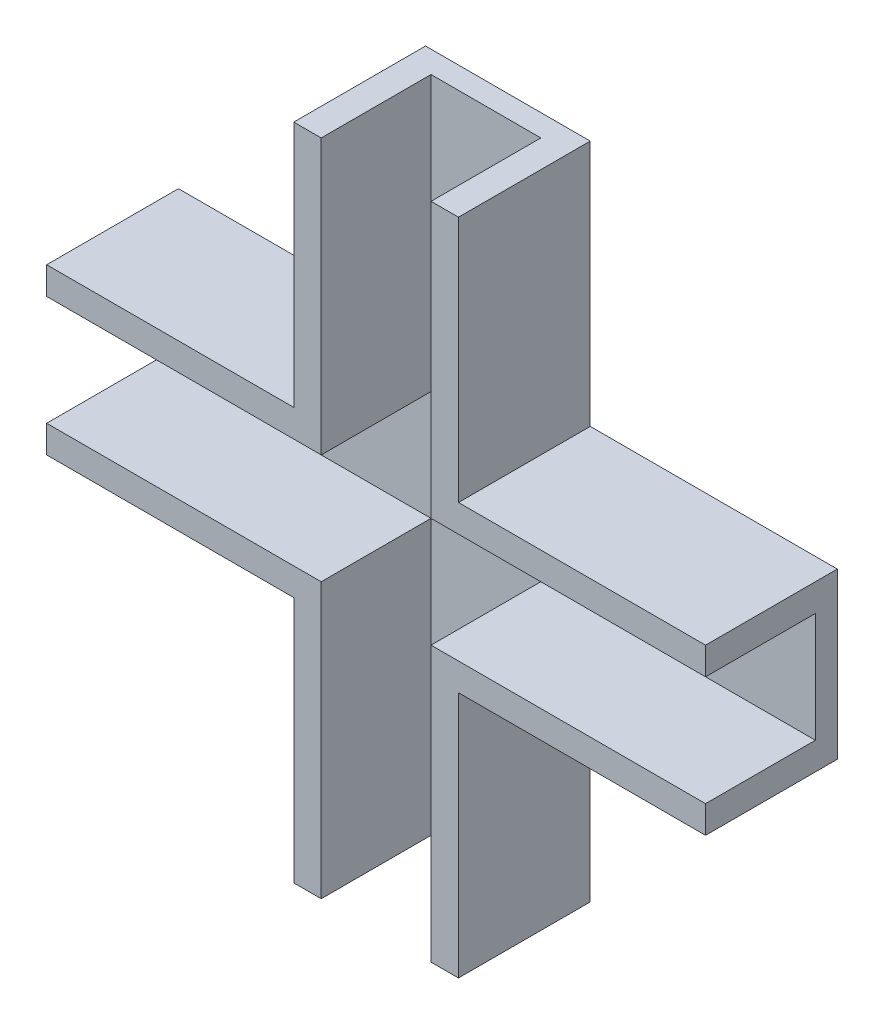
ISO-10303-21;
HEADER;
FILE_DESCRIPTION(('STEP AP214'),'2;1');
FILE_NAME('part.step','',(''),(''),'','','');
FILE_SCHEMA(('AUTOMOTIVE_DESIGN { 1 0 10303 214 1 1 1 1 }'));
ENDSEC;
DATA;
#1=APPLICATION_CONTEXT('core data for automotive mechanical design processes');
#2=APPLICATION_PROTOCOL_DEFINITION('international standard','automotive_design',2000,#1);
#3=PRODUCT_CONTEXT('',#1,'mechanical');
#4=PRODUCT('Part','Part','',(#3));
#5=PRODUCT_RELATED_PRODUCT_CATEGORY('part','',(#4));
#6=PRODUCT_DEFINITION_FORMATION('','',#4);
#7=PRODUCT_DEFINITION_CONTEXT('part definition',#1,'design');
#8=PRODUCT_DEFINITION('design','',#6,#7);
#9=PRODUCT_DEFINITION_SHAPE('','',#8);
#10=(LENGTH_UNIT() NAMED_UNIT(*) SI_UNIT(.MILLI.,.METRE.));
#11=(NAMED_UNIT(*) PLANE_ANGLE_UNIT() SI_UNIT($,.RADIAN.));
#12=(NAMED_UNIT(*) SI_UNIT($,.STERADIAN.) SOLID_ANGLE_UNIT());
#13=UNCERTAINTY_MEASURE_WITH_UNIT(LENGTH_MEASURE(1.E-05),#10,'distance_accuracy_value','');
#14=(GEOMETRIC_REPRESENTATION_CONTEXT(3) GLOBAL_UNCERTAINTY_ASSIGNED_CONTEXT((#13)) GLOBAL_UNIT_ASSIGNED_CONTEXT((#10,
#11,#12)) REPRESENTATION_CONTEXT('',''));
#15=CARTESIAN_POINT('',(0.,0.,0.));
#16=DIRECTION('',(0.,0.,1.));
#17=DIRECTION('',(1.,0.,0.));
#18=AXIS2_PLACEMENT_3D('',#15,#16,#17);
#19=CARTESIAN_POINT('',(0.,0.,6.));
#20=DIRECTION('',(0.,0.,1.));
#21=DIRECTION('',(1.,0.,0.));
#22=AXIS2_PLACEMENT_3D('',#19,#20,#21);
#23=PLANE('',#22);
#24=DIRECTION('',(0.,-1.,0.));
#25=VECTOR('',#24,1.);
#26=CARTESIAN_POINT('',(2.5,0.,6.));
#27=LINE('',#26,#25);
#28=CARTESIAN_POINT('',(2.5,15.,6.));
#29=VERTEX_POINT('',#28);
#30=CARTESIAN_POINT('',(2.5,2.5,6.));
#31=VERTEX_POINT('',#30);
#32=EDGE_CURVE('E370',#29,#31,#27,.T.);
#33=ORIENTED_EDGE('',*,*,#32,.T.);
#34=DIRECTION('',(1.,0.,0.));
#35=VECTOR('',#34,1.);
#36=CARTESIAN_POINT('',(0.,2.5,6.));
#37=LINE('',#36,#35);
#38=CARTESIAN_POINT('',(15.,2.50000000000001,6.));
#39=VERTEX_POINT('',#38);
#40=EDGE_CURVE('E367',#31,#39,#37,.T.);
#41=ORIENTED_EDGE('',*,*,#40,.T.);
#42=DIRECTION('',(0.,1.,0.));
#43=VECTOR('',#42,1.);
#44=CARTESIAN_POINT('',(15.,3.75,6.));
#45=LINE('',#44,#43);
#46=CARTESIAN_POINT('',(15.,3.75,6.));
#47=VERTEX_POINT('',#46);
#48=EDGE_CURVE('E120',#39,#47,#45,.T.);
#49=ORIENTED_EDGE('',*,*,#48,.T.);
#50=DIRECTION('',(-1.,0.,0.));
#51=VECTOR('',#50,1.);
#52=CARTESIAN_POINT('',(3.75,3.75,6.));
#53=LINE('',#52,#51);
#54=CARTESIAN_POINT('',(3.75,3.75,6.));
#55=VERTEX_POINT('',#54);
#56=EDGE_CURVE('E325',#47,#55,#53,.T.);
#57=ORIENTED_EDGE('',*,*,#56,.T.);
#58=DIRECTION('',(0.,1.,0.));
#59=VECTOR('',#58,1.);
#60=CARTESIAN_POINT('',(3.75,15.,6.));
#61=LINE('',#60,#59);
#62=CARTESIAN_POINT('',(3.75,15.,6.));
#63=VERTEX_POINT('',#62);
#64=EDGE_CURVE('E231',#55,#63,#61,.T.);
#65=ORIENTED_EDGE('',*,*,#64,.T.);
#66=DIRECTION('',(-1.,0.,0.));
#67=VECTOR('',#66,1.);
#68=CARTESIAN_POINT('',(-3.75,15.,6.));
#69=LINE('',#68,#67);
#70=EDGE_CURVE('E251',#63,#29,#69,.T.);
#71=ORIENTED_EDGE('',*,*,#70,.T.);
#72=EDGE_LOOP('',(#33,#41,#49,#57,#65,#71));
#73=FACE_BOUND('',#72,.T.);
#74=ADVANCED_FACE('F39',(#73),#23,.T.);
#75=DIRECTION('',(0.,1.,0.));
#76=VECTOR('',#75,1.);
#77=CARTESIAN_POINT('',(2.5,0.,6.));
#78=LINE('',#77,#76);
#79=CARTESIAN_POINT('',(2.5,-15.,6.));
#80=VERTEX_POINT('',#79);
#81=CARTESIAN_POINT('',(2.5,-2.5,6.));
#82=VERTEX_POINT('',#81);
#83=EDGE_CURVE('E154',#80,#82,#78,.T.);
#84=ORIENTED_EDGE('',*,*,#83,.F.);
#85=DIRECTION('',(1.,0.,0.));
#86=VECTOR('',#85,1.);
#87=CARTESIAN_POINT('',(-3.75,-15.,6.));
#88=LINE('',#87,#86);
#89=CARTESIAN_POINT('',(3.75,-15.,6.));
#90=VERTEX_POINT('',#89);
#91=EDGE_CURVE('E150',#80,#90,#88,.T.);
#92=ORIENTED_EDGE('',*,*,#91,.T.);
#93=DIRECTION('',(0.,1.,0.));
#94=VECTOR('',#93,1.);
#95=CARTESIAN_POINT('',(3.75,-15.,6.));
#96=LINE('',#95,#94);
#97=CARTESIAN_POINT('',(3.75,-3.75,6.));
#98=VERTEX_POINT('',#97);
#99=EDGE_CURVE('E151',#90,#98,#96,.T.);
#100=ORIENTED_EDGE('',*,*,#99,.T.);
#101=DIRECTION('',(1.,0.,0.));
#102=VECTOR('',#101,1.);
#103=CARTESIAN_POINT('',(3.75,-3.75,6.));
#104=LINE('',#103,#102);
#105=CARTESIAN_POINT('',(15.,-3.75,6.));
#106=VERTEX_POINT('',#105);
#107=EDGE_CURVE('E61',#98,#106,#104,.T.);
#108=ORIENTED_EDGE('',*,*,#107,.T.);
#109=CARTESIAN_POINT('',(15.,-2.5,6.));
#110=VERTEX_POINT('',#109);
#111=EDGE_CURVE('E319',#106,#110,#45,.T.);
#112=ORIENTED_EDGE('',*,*,#111,.T.);
#113=DIRECTION('',(1.,0.,0.));
#114=VECTOR('',#113,1.);
#115=CARTESIAN_POINT('',(0.,-2.5,6.));
#116=LINE('',#115,#114);
#117=EDGE_CURVE('E375',#82,#110,#116,.T.);
#118=ORIENTED_EDGE('',*,*,#117,.F.);
#119=EDGE_LOOP('',(#84,#92,#100,#108,#112,#118));
#120=FACE_BOUND('',#119,.T.);
#121=ADVANCED_FACE('F149',(#120),#23,.T.);
#122=DIRECTION('',(0.,-1.,0.));
#123=VECTOR('',#122,1.);
#124=CARTESIAN_POINT('',(-2.5,0.,6.));
#125=LINE('',#124,#123);
#126=CARTESIAN_POINT('',(-2.5,15.,6.));
#127=VERTEX_POINT('',#126);
#128=CARTESIAN_POINT('',(-2.5,2.5,6.));
#129=VERTEX_POINT('',#128);
#130=EDGE_CURVE('E327',#127,#129,#125,.T.);
#131=ORIENTED_EDGE('',*,*,#130,.F.);
#132=CARTESIAN_POINT('',(-3.75,15.,6.));
#133=VERTEX_POINT('',#132);
#134=EDGE_CURVE('E256',#127,#133,#69,.T.);
#135=ORIENTED_EDGE('',*,*,#134,.T.);
#136=DIRECTION('',(0.,-1.,0.));
#137=VECTOR('',#136,1.);
#138=CARTESIAN_POINT('',(-3.75,3.75,6.));
#139=LINE('',#138,#137);
#140=CARTESIAN_POINT('',(-3.75,3.75,6.));
#141=VERTEX_POINT('',#140);
#142=EDGE_CURVE('E247',#133,#141,#139,.T.);
#143=ORIENTED_EDGE('',*,*,#142,.T.);
#144=DIRECTION('',(-1.,0.,0.));
#145=VECTOR('',#144,1.);
#146=CARTESIAN_POINT('',(-15.,3.75,6.));
#147=LINE('',#146,#145);
#148=CARTESIAN_POINT('',(-15.,3.75,6.));
#149=VERTEX_POINT('',#148);
#150=EDGE_CURVE('E252',#141,#149,#147,.T.);
#151=ORIENTED_EDGE('',*,*,#150,.T.);
#152=DIRECTION('',(0.,-1.,0.));
#153=VECTOR('',#152,1.);
#154=CARTESIAN_POINT('',(-15.,3.75,6.));
#155=LINE('',#154,#153);
#156=CARTESIAN_POINT('',(-15.,2.5,6.));
#157=VERTEX_POINT('',#156);
#158=EDGE_CURVE('E265',#149,#157,#155,.T.);
#159=ORIENTED_EDGE('',*,*,#158,.T.);
#160=DIRECTION('',(1.,0.,0.));
#161=VECTOR('',#160,1.);
#162=CARTESIAN_POINT('',(0.,2.5,6.));
#163=LINE('',#162,#161);
#164=EDGE_CURVE('E358',#157,#129,#163,.T.);
#165=ORIENTED_EDGE('',*,*,#164,.T.);
#166=EDGE_LOOP('',(#131,#135,#143,#151,#159,#165));
#167=FACE_BOUND('',#166,.T.);
#168=ADVANCED_FACE('F322',(#167),#23,.T.);
#169=CARTESIAN_POINT('',(15.,3.75,6.));
#170=DIRECTION('',(-1.,0.,0.));
#171=DIRECTION('',(0.,0.,1.));
#172=AXIS2_PLACEMENT_3D('',#169,#170,#171);
#173=PLANE('',#172);
#174=DIRECTION('',(0.,1.,0.));
#175=VECTOR('',#174,1.);
#176=CARTESIAN_POINT('',(15.,0.,1.));
#177=LINE('',#176,#175);
#178=CARTESIAN_POINT('',(15.,-2.5,1.));
#179=VERTEX_POINT('',#178);
#180=CARTESIAN_POINT('',(15.,2.50000000000001,1.));
#181=VERTEX_POINT('',#180);
#182=EDGE_CURVE('E398',#179,#181,#177,.T.);
#183=ORIENTED_EDGE('',*,*,#182,.F.);
#184=DIRECTION('',(0.,0.,1.));
#185=VECTOR('',#184,1.);
#186=CARTESIAN_POINT('',(15.,-2.5,1.));
#187=LINE('',#186,#185);
#188=EDGE_CURVE('E314',#179,#110,#187,.T.);
#189=ORIENTED_EDGE('',*,*,#188,.T.);
#190=ORIENTED_EDGE('',*,*,#111,.F.);
#191=DIRECTION('',(0.,0.,-1.));
#192=VECTOR('',#191,1.);
#193=CARTESIAN_POINT('',(15.,-3.75,6.));
#194=LINE('',#193,#192);
#195=CARTESIAN_POINT('',(15.,-3.75,0.));
#196=VERTEX_POINT('',#195);
#197=EDGE_CURVE('E174',#106,#196,#194,.T.);
#198=ORIENTED_EDGE('',*,*,#197,.T.);
#199=DIRECTION('',(0.,1.,0.));
#200=VECTOR('',#199,1.);
#201=CARTESIAN_POINT('',(15.,3.75,0.));
#202=LINE('',#201,#200);
#203=CARTESIAN_POINT('',(15.,3.75,0.));
#204=VERTEX_POINT('',#203);
#205=EDGE_CURVE('E179',#196,#204,#202,.T.);
#206=ORIENTED_EDGE('',*,*,#205,.T.);
#207=DIRECTION('',(0.,0.,-1.));
#208=VECTOR('',#207,1.);
#209=CARTESIAN_POINT('',(15.,3.75,6.));
#210=LINE('',#209,#208);
#211=EDGE_CURVE('E11',#47,#204,#210,.T.);
#212=ORIENTED_EDGE('',*,*,#211,.F.);
#213=ORIENTED_EDGE('',*,*,#48,.F.);
#214=DIRECTION('',(0.,0.,1.));
#215=VECTOR('',#214,1.);
#216=CARTESIAN_POINT('',(15.,2.50000000000001,1.));
#217=LINE('',#216,#215);
#218=EDGE_CURVE('E313',#181,#39,#217,.T.);
#219=ORIENTED_EDGE('',*,*,#218,.F.);
#220=EDGE_LOOP('',(#183,#189,#190,#198,#206,#212,#213,#219));
#221=FACE_BOUND('',#220,.T.);
#222=ADVANCED_FACE('F41',(#221),#173,.F.);
#223=CARTESIAN_POINT('',(3.75,3.75,6.));
#224=DIRECTION('',(0.,-1.,0.));
#225=DIRECTION('',(0.,0.,-1.));
#226=AXIS2_PLACEMENT_3D('',#223,#224,#225);
#227=PLANE('',#226);
#228=DIRECTION('',(-1.,0.,0.));
#229=VECTOR('',#228,1.);
#230=CARTESIAN_POINT('',(3.75,3.75,0.));
#231=LINE('',#230,#229);
#232=CARTESIAN_POINT('',(3.75,3.75,0.));
#233=VERTEX_POINT('',#232);
#234=EDGE_CURVE('E181',#204,#233,#231,.T.);
#235=ORIENTED_EDGE('',*,*,#234,.T.);
#236=DIRECTION('',(0.,0.,-1.));
#237=VECTOR('',#236,1.);
#238=CARTESIAN_POINT('',(3.75,3.75,6.));
#239=LINE('',#238,#237);
#240=EDGE_CURVE('E50',#55,#233,#239,.T.);
#241=ORIENTED_EDGE('',*,*,#240,.F.);
#242=ORIENTED_EDGE('',*,*,#56,.F.);
#243=ORIENTED_EDGE('',*,*,#211,.T.);
#244=EDGE_LOOP('',(#235,#241,#242,#243));
#245=FACE_BOUND('',#244,.T.);
#246=ADVANCED_FACE('F649',(#245),#227,.F.);
#247=CARTESIAN_POINT('',(3.75,15.,6.));
#248=DIRECTION('',(-1.,0.,0.));
#249=DIRECTION('',(0.,0.,1.));
#250=AXIS2_PLACEMENT_3D('',#247,#248,#249);
#251=PLANE('',#250);
#252=DIRECTION('',(0.,1.,0.));
#253=VECTOR('',#252,1.);
#254=CARTESIAN_POINT('',(3.75,15.,0.));
#255=LINE('',#254,#253);
#256=CARTESIAN_POINT('',(3.75,15.,0.));
#257=VERTEX_POINT('',#256);
#258=EDGE_CURVE('E188',#233,#257,#255,.T.);
#259=ORIENTED_EDGE('',*,*,#258,.T.);
#260=DIRECTION('',(0.,0.,-1.));
#261=VECTOR('',#260,1.);
#262=CARTESIAN_POINT('',(3.75,15.,6.));
#263=LINE('',#262,#261);
#264=EDGE_CURVE('E225',#63,#257,#263,.T.);
#265=ORIENTED_EDGE('',*,*,#264,.F.);
#266=ORIENTED_EDGE('',*,*,#64,.F.);
#267=ORIENTED_EDGE('',*,*,#240,.T.);
#268=EDGE_LOOP('',(#259,#265,#266,#267));
#269=FACE_BOUND('',#268,.T.);
#270=ADVANCED_FACE('F227',(#269),#251,.F.);
#271=CARTESIAN_POINT('',(-3.75,15.,6.));
#272=DIRECTION('',(0.,-1.,0.));
#273=DIRECTION('',(0.,0.,-1.));
#274=AXIS2_PLACEMENT_3D('',#271,#272,#273);
#275=PLANE('',#274);
#276=DIRECTION('',(-1.,0.,0.));
#277=VECTOR('',#276,1.);
#278=CARTESIAN_POINT('',(0.,15.,1.));
#279=LINE('',#278,#277);
#280=CARTESIAN_POINT('',(2.5,15.,1.));
#281=VERTEX_POINT('',#280);
#282=CARTESIAN_POINT('',(-2.5,15.,1.));
#283=VERTEX_POINT('',#282);
#284=EDGE_CURVE('E386',#281,#283,#279,.T.);
#285=ORIENTED_EDGE('',*,*,#284,.F.);
#286=DIRECTION('',(0.,0.,1.));
#287=VECTOR('',#286,1.);
#288=CARTESIAN_POINT('',(2.5,15.,1.));
#289=LINE('',#288,#287);
#290=EDGE_CURVE('E304',#281,#29,#289,.T.);
#291=ORIENTED_EDGE('',*,*,#290,.T.);
#292=ORIENTED_EDGE('',*,*,#70,.F.);
#293=ORIENTED_EDGE('',*,*,#264,.T.);
#294=DIRECTION('',(-1.,0.,0.));
#295=VECTOR('',#294,1.);
#296=CARTESIAN_POINT('',(-3.75,15.,0.));
#297=LINE('',#296,#295);
#298=CARTESIAN_POINT('',(-3.75,15.,0.));
#299=VERTEX_POINT('',#298);
#300=EDGE_CURVE('E186',#257,#299,#297,.T.);
#301=ORIENTED_EDGE('',*,*,#300,.T.);
#302=DIRECTION('',(0.,0.,-1.));
#303=VECTOR('',#302,1.);
#304=CARTESIAN_POINT('',(-3.75,15.,6.));
#305=LINE('',#304,#303);
#306=EDGE_CURVE('E218',#133,#299,#305,.T.);
#307=ORIENTED_EDGE('',*,*,#306,.F.);
#308=ORIENTED_EDGE('',*,*,#134,.F.);
#309=DIRECTION('',(0.,0.,1.));
#310=VECTOR('',#309,1.);
#311=CARTESIAN_POINT('',(-2.5,15.,1.));
#312=LINE('',#311,#310);
#313=EDGE_CURVE('E305',#283,#127,#312,.T.);
#314=ORIENTED_EDGE('',*,*,#313,.F.);
#315=EDGE_LOOP('',(#285,#291,#292,#293,#301,#307,#308,#314));
#316=FACE_BOUND('',#315,.T.);
#317=ADVANCED_FACE('F245',(#316),#275,.F.);
#318=CARTESIAN_POINT('',(-3.75,3.75,6.));
#319=DIRECTION('',(1.,0.,0.));
#320=DIRECTION('',(0.,0.,-1.));
#321=AXIS2_PLACEMENT_3D('',#318,#319,#320);
#322=PLANE('',#321);
#323=DIRECTION('',(0.,-1.,0.));
#324=VECTOR('',#323,1.);
#325=CARTESIAN_POINT('',(-3.75,3.75,0.));
#326=LINE('',#325,#324);
#327=CARTESIAN_POINT('',(-3.75,3.75,0.));
#328=VERTEX_POINT('',#327);
#329=EDGE_CURVE('E189',#299,#328,#326,.T.);
#330=ORIENTED_EDGE('',*,*,#329,.T.);
#331=DIRECTION('',(0.,0.,-1.));
#332=VECTOR('',#331,1.);
#333=CARTESIAN_POINT('',(-3.75,3.75,6.));
#334=LINE('',#333,#332);
#335=EDGE_CURVE('E216',#141,#328,#334,.T.);
#336=ORIENTED_EDGE('',*,*,#335,.F.);
#337=ORIENTED_EDGE('',*,*,#142,.F.);
#338=ORIENTED_EDGE('',*,*,#306,.T.);
#339=EDGE_LOOP('',(#330,#336,#337,#338));
#340=FACE_BOUND('',#339,.T.);
#341=ADVANCED_FACE('F250',(#340),#322,.F.);
#342=CARTESIAN_POINT('',(-15.,3.75,6.));
#343=DIRECTION('',(0.,-1.,0.));
#344=DIRECTION('',(0.,0.,-1.));
#345=AXIS2_PLACEMENT_3D('',#342,#343,#344);
#346=PLANE('',#345);
#347=DIRECTION('',(-1.,0.,0.));
#348=VECTOR('',#347,1.);
#349=CARTESIAN_POINT('',(-15.,3.75,0.));
#350=LINE('',#349,#348);
#351=CARTESIAN_POINT('',(-15.,3.75,0.));
#352=VERTEX_POINT('',#351);
#353=EDGE_CURVE('E195',#328,#352,#350,.T.);
#354=ORIENTED_EDGE('',*,*,#353,.T.);
#355=DIRECTION('',(0.,0.,-1.));
#356=VECTOR('',#355,1.);
#357=CARTESIAN_POINT('',(-15.,3.75,6.));
#358=LINE('',#357,#356);
#359=EDGE_CURVE('E213',#149,#352,#358,.T.);
#360=ORIENTED_EDGE('',*,*,#359,.F.);
#361=ORIENTED_EDGE('',*,*,#150,.F.);
#362=ORIENTED_EDGE('',*,*,#335,.T.);
#363=EDGE_LOOP('',(#354,#360,#361,#362));
#364=FACE_BOUND('',#363,.T.);
#365=ADVANCED_FACE('F614',(#364),#346,.F.);
#366=CARTESIAN_POINT('',(-15.,3.75,6.));
#367=DIRECTION('',(1.,0.,0.));
#368=DIRECTION('',(0.,0.,-1.));
#369=AXIS2_PLACEMENT_3D('',#366,#367,#368);
#370=PLANE('',#369);
#371=DIRECTION('',(0.,-1.,0.));
#372=VECTOR('',#371,1.);
#373=CARTESIAN_POINT('',(-15.,0.,1.));
#374=LINE('',#373,#372);
#375=CARTESIAN_POINT('',(-15.,2.5,1.));
#376=VERTEX_POINT('',#375);
#377=CARTESIAN_POINT('',(-15.,-2.5,1.));
#378=VERTEX_POINT('',#377);
#379=EDGE_CURVE('E379',#376,#378,#374,.T.);
#380=ORIENTED_EDGE('',*,*,#379,.F.);
#381=DIRECTION('',(0.,0.,1.));
#382=VECTOR('',#381,1.);
#383=CARTESIAN_POINT('',(-15.,2.5,1.));
#384=LINE('',#383,#382);
#385=EDGE_CURVE('E298',#376,#157,#384,.T.);
#386=ORIENTED_EDGE('',*,*,#385,.T.);
#387=ORIENTED_EDGE('',*,*,#158,.F.);
#388=ORIENTED_EDGE('',*,*,#359,.T.);
#389=DIRECTION('',(0.,-1.,0.));
#390=VECTOR('',#389,1.);
#391=CARTESIAN_POINT('',(-15.,3.75,0.));
#392=LINE('',#391,#390);
#393=CARTESIAN_POINT('',(-15.,-3.75,0.));
#394=VERTEX_POINT('',#393);
#395=EDGE_CURVE('E192',#352,#394,#392,.T.);
#396=ORIENTED_EDGE('',*,*,#395,.T.);
#397=DIRECTION('',(0.,0.,-1.));
#398=VECTOR('',#397,1.);
#399=CARTESIAN_POINT('',(-15.,-3.75,6.));
#400=LINE('',#399,#398);
#401=CARTESIAN_POINT('',(-15.,-3.75,6.));
#402=VERTEX_POINT('',#401);
#403=EDGE_CURVE('E209',#402,#394,#400,.T.);
#404=ORIENTED_EDGE('',*,*,#403,.F.);
#405=CARTESIAN_POINT('',(-15.,-2.5,6.));
#406=VERTEX_POINT('',#405);
#407=EDGE_CURVE('E254',#406,#402,#155,.T.);
#408=ORIENTED_EDGE('',*,*,#407,.F.);
#409=DIRECTION('',(0.,0.,1.));
#410=VECTOR('',#409,1.);
#411=CARTESIAN_POINT('',(-15.,-2.5,1.));
#412=LINE('',#411,#410);
#413=EDGE_CURVE('E289',#378,#406,#412,.T.);
#414=ORIENTED_EDGE('',*,*,#413,.F.);
#415=EDGE_LOOP('',(#380,#386,#387,#388,#396,#404,#408,#414));
#416=FACE_BOUND('',#415,.T.);
#417=ADVANCED_FACE('F604',(#416),#370,.F.);
#418=CARTESIAN_POINT('',(-15.,-3.75,6.));
#419=DIRECTION('',(0.,1.,0.));
#420=DIRECTION('',(0.,0.,1.));
#421=AXIS2_PLACEMENT_3D('',#418,#419,#420);
#422=PLANE('',#421);
#423=DIRECTION('',(1.,0.,0.));
#424=VECTOR('',#423,1.);
#425=CARTESIAN_POINT('',(-15.,-3.75,0.));
#426=LINE('',#425,#424);
#427=CARTESIAN_POINT('',(-3.75,-3.75,0.));
#428=VERTEX_POINT('',#427);
#429=EDGE_CURVE('E198',#394,#428,#426,.T.);
#430=ORIENTED_EDGE('',*,*,#429,.T.);
#431=DIRECTION('',(0.,0.,-1.));
#432=VECTOR('',#431,1.);
#433=CARTESIAN_POINT('',(-3.75,-3.75,6.));
#434=LINE('',#433,#432);
#435=CARTESIAN_POINT('',(-3.75,-3.75,6.));
#436=VERTEX_POINT('',#435);
#437=EDGE_CURVE('E210',#436,#428,#434,.T.);
#438=ORIENTED_EDGE('',*,*,#437,.F.);
#439=DIRECTION('',(1.,0.,0.));
#440=VECTOR('',#439,1.);
#441=CARTESIAN_POINT('',(-15.,-3.75,6.));
#442=LINE('',#441,#440);
#443=EDGE_CURVE('E264',#402,#436,#442,.T.);
#444=ORIENTED_EDGE('',*,*,#443,.F.);
#445=ORIENTED_EDGE('',*,*,#403,.T.);
#446=EDGE_LOOP('',(#430,#438,#444,#445));
#447=FACE_BOUND('',#446,.T.);
#448=ADVANCED_FACE('F596',(#447),#422,.F.);
#449=CARTESIAN_POINT('',(-3.75,-3.75,6.));
#450=DIRECTION('',(1.,0.,0.));
#451=DIRECTION('',(0.,0.,-1.));
#452=AXIS2_PLACEMENT_3D('',#449,#450,#451);
#453=PLANE('',#452);
#454=DIRECTION('',(0.,-1.,0.));
#455=VECTOR('',#454,1.);
#456=CARTESIAN_POINT('',(-3.75,-3.75,0.));
#457=LINE('',#456,#455);
#458=CARTESIAN_POINT('',(-3.75,-15.,0.));
#459=VERTEX_POINT('',#458);
#460=EDGE_CURVE('E196',#428,#459,#457,.T.);
#461=ORIENTED_EDGE('',*,*,#460,.T.);
#462=DIRECTION('',(0.,0.,-1.));
#463=VECTOR('',#462,1.);
#464=CARTESIAN_POINT('',(-3.75,-15.,6.));
#465=LINE('',#464,#463);
#466=CARTESIAN_POINT('',(-3.75,-15.,6.));
#467=VERTEX_POINT('',#466);
#468=EDGE_CURVE('E168',#467,#459,#465,.T.);
#469=ORIENTED_EDGE('',*,*,#468,.F.);
#470=DIRECTION('',(0.,-1.,0.));
#471=VECTOR('',#470,1.);
#472=CARTESIAN_POINT('',(-3.75,-3.75,6.));
#473=LINE('',#472,#471);
#474=EDGE_CURVE('E157',#436,#467,#473,.T.);
#475=ORIENTED_EDGE('',*,*,#474,.F.);
#476=ORIENTED_EDGE('',*,*,#437,.T.);
#477=EDGE_LOOP('',(#461,#469,#475,#476));
#478=FACE_BOUND('',#477,.T.);
#479=ADVANCED_FACE('F280',(#478),#453,.F.);
#480=CARTESIAN_POINT('',(-3.75,-15.,6.));
#481=DIRECTION('',(0.,1.,0.));
#482=DIRECTION('',(0.,0.,1.));
#483=AXIS2_PLACEMENT_3D('',#480,#481,#482);
#484=PLANE('',#483);
#485=DIRECTION('',(1.,0.,0.));
#486=VECTOR('',#485,1.);
#487=CARTESIAN_POINT('',(0.,-15.,1.));
#488=LINE('',#487,#486);
#489=CARTESIAN_POINT('',(-2.5,-15.,1.));
#490=VERTEX_POINT('',#489);
#491=CARTESIAN_POINT('',(2.5,-15.,1.));
#492=VERTEX_POINT('',#491);
#493=EDGE_CURVE('E283',#490,#492,#488,.T.);
#494=ORIENTED_EDGE('',*,*,#493,.F.);
#495=DIRECTION('',(0.,0.,1.));
#496=VECTOR('',#495,1.);
#497=CARTESIAN_POINT('',(-2.5,-15.,1.));
#498=LINE('',#497,#496);
#499=CARTESIAN_POINT('',(-2.5,-15.,6.));
#500=VERTEX_POINT('',#499);
#501=EDGE_CURVE('E278',#490,#500,#498,.T.);
#502=ORIENTED_EDGE('',*,*,#501,.T.);
#503=EDGE_CURVE('E158',#467,#500,#88,.T.);
#504=ORIENTED_EDGE('',*,*,#503,.F.);
#505=ORIENTED_EDGE('',*,*,#468,.T.);
#506=DIRECTION('',(1.,0.,0.));
#507=VECTOR('',#506,1.);
#508=CARTESIAN_POINT('',(-3.75,-15.,0.));
#509=LINE('',#508,#507);
#510=CARTESIAN_POINT('',(3.75,-15.,0.));
#511=VERTEX_POINT('',#510);
#512=EDGE_CURVE('E170',#459,#511,#509,.T.);
#513=ORIENTED_EDGE('',*,*,#512,.T.);
#514=DIRECTION('',(0.,0.,-1.));
#515=VECTOR('',#514,1.);
#516=CARTESIAN_POINT('',(3.75,-15.,6.));
#517=LINE('',#516,#515);
#518=EDGE_CURVE('E165',#90,#511,#517,.T.);
#519=ORIENTED_EDGE('',*,*,#518,.F.);
#520=ORIENTED_EDGE('',*,*,#91,.F.);
#521=DIRECTION('',(0.,0.,1.));
#522=VECTOR('',#521,1.);
#523=CARTESIAN_POINT('',(2.5,-15.,1.));
#524=LINE('',#523,#522);
#525=EDGE_CURVE('E184',#492,#80,#524,.T.);
#526=ORIENTED_EDGE('',*,*,#525,.F.);
#527=EDGE_LOOP('',(#494,#502,#504,#505,#513,#519,#520,#526));
#528=FACE_BOUND('',#527,.T.);
#529=ADVANCED_FACE('F163',(#528),#484,.F.);
#530=CARTESIAN_POINT('',(3.75,-15.,6.));
#531=DIRECTION('',(-1.,0.,0.));
#532=DIRECTION('',(0.,0.,1.));
#533=AXIS2_PLACEMENT_3D('',#530,#531,#532);
#534=PLANE('',#533);
#535=DIRECTION('',(0.,1.,0.));
#536=VECTOR('',#535,1.);
#537=CARTESIAN_POINT('',(3.75,-15.,0.));
#538=LINE('',#537,#536);
#539=CARTESIAN_POINT('',(3.75,-3.75,0.));
#540=VERTEX_POINT('',#539);
#541=EDGE_CURVE('E203',#511,#540,#538,.T.);
#542=ORIENTED_EDGE('',*,*,#541,.T.);
#543=DIRECTION('',(0.,0.,-1.));
#544=VECTOR('',#543,1.);
#545=CARTESIAN_POINT('',(3.75,-3.75,6.));
#546=LINE('',#545,#544);
#547=EDGE_CURVE('E173',#98,#540,#546,.T.);
#548=ORIENTED_EDGE('',*,*,#547,.F.);
#549=ORIENTED_EDGE('',*,*,#99,.F.);
#550=ORIENTED_EDGE('',*,*,#518,.T.);
#551=EDGE_LOOP('',(#542,#548,#549,#550));
#552=FACE_BOUND('',#551,.T.);
#553=ADVANCED_FACE('F171',(#552),#534,.F.);
#554=CARTESIAN_POINT('',(3.75,-3.75,6.));
#555=DIRECTION('',(0.,1.,0.));
#556=DIRECTION('',(0.,0.,1.));
#557=AXIS2_PLACEMENT_3D('',#554,#555,#556);
#558=PLANE('',#557);
#559=DIRECTION('',(1.,0.,0.));
#560=VECTOR('',#559,1.);
#561=CARTESIAN_POINT('',(3.75,-3.75,0.));
#562=LINE('',#561,#560);
#563=EDGE_CURVE('E107',#540,#196,#562,.T.);
#564=ORIENTED_EDGE('',*,*,#563,.T.);
#565=ORIENTED_EDGE('',*,*,#197,.F.);
#566=ORIENTED_EDGE('',*,*,#107,.F.);
#567=ORIENTED_EDGE('',*,*,#547,.T.);
#568=EDGE_LOOP('',(#564,#565,#566,#567));
#569=FACE_BOUND('',#568,.T.);
#570=ADVANCED_FACE('F449',(#569),#558,.F.);
#571=DIRECTION('',(1.,0.,0.));
#572=VECTOR('',#571,1.);
#573=CARTESIAN_POINT('',(0.,-2.5,6.));
#574=LINE('',#573,#572);
#575=CARTESIAN_POINT('',(-2.5,-2.5,6.));
#576=VERTEX_POINT('',#575);
#577=EDGE_CURVE('E352',#406,#576,#574,.T.);
#578=ORIENTED_EDGE('',*,*,#577,.F.);
#579=ORIENTED_EDGE('',*,*,#407,.T.);
#580=ORIENTED_EDGE('',*,*,#443,.T.);
#581=ORIENTED_EDGE('',*,*,#474,.T.);
#582=ORIENTED_EDGE('',*,*,#503,.T.);
#583=DIRECTION('',(0.,1.,0.));
#584=VECTOR('',#583,1.);
#585=CARTESIAN_POINT('',(-2.5,0.,6.));
#586=LINE('',#585,#584);
#587=EDGE_CURVE('E348',#500,#576,#586,.T.);
#588=ORIENTED_EDGE('',*,*,#587,.T.);
#589=EDGE_LOOP('',(#578,#579,#580,#581,#582,#588));
#590=FACE_BOUND('',#589,.T.);
#591=ADVANCED_FACE('F269',(#590),#23,.T.);
#592=CARTESIAN_POINT('',(0.,0.,0.));
#593=DIRECTION('',(0.,0.,1.));
#594=DIRECTION('',(1.,0.,0.));
#595=AXIS2_PLACEMENT_3D('',#592,#593,#594);
#596=PLANE('',#595);
#597=ORIENTED_EDGE('',*,*,#205,.F.);
#598=ORIENTED_EDGE('',*,*,#563,.F.);
#599=ORIENTED_EDGE('',*,*,#541,.F.);
#600=ORIENTED_EDGE('',*,*,#512,.F.);
#601=ORIENTED_EDGE('',*,*,#460,.F.);
#602=ORIENTED_EDGE('',*,*,#429,.F.);
#603=ORIENTED_EDGE('',*,*,#395,.F.);
#604=ORIENTED_EDGE('',*,*,#353,.F.);
#605=ORIENTED_EDGE('',*,*,#329,.F.);
#606=ORIENTED_EDGE('',*,*,#300,.F.);
#607=ORIENTED_EDGE('',*,*,#258,.F.);
#608=ORIENTED_EDGE('',*,*,#234,.F.);
#609=EDGE_LOOP('',(#597,#598,#599,#600,#601,#602,#603,#604,#605,#606,#607,#608));
#610=FACE_BOUND('',#609,.T.);
#611=ADVANCED_FACE('F237',(#610),#596,.F.);
#612=CARTESIAN_POINT('',(2.5,0.,1.));
#613=DIRECTION('',(1.,0.,0.));
#614=DIRECTION('',(0.,1.,0.));
#615=AXIS2_PLACEMENT_3D('',#612,#613,#614);
#616=PLANE('',#615);
#617=ORIENTED_EDGE('',*,*,#83,.T.);
#618=DIRECTION('',(0.,0.,1.));
#619=VECTOR('',#618,1.);
#620=CARTESIAN_POINT('',(2.5,-2.5,1.));
#621=LINE('',#620,#619);
#622=CARTESIAN_POINT('',(2.5,-2.5,1.));
#623=VERTEX_POINT('',#622);
#624=EDGE_CURVE('E320',#623,#82,#621,.T.);
#625=ORIENTED_EDGE('',*,*,#624,.F.);
#626=DIRECTION('',(0.,1.,0.));
#627=VECTOR('',#626,1.);
#628=CARTESIAN_POINT('',(2.5,0.,1.));
#629=LINE('',#628,#627);
#630=EDGE_CURVE('E359',#492,#623,#629,.T.);
#631=ORIENTED_EDGE('',*,*,#630,.F.);
#632=ORIENTED_EDGE('',*,*,#525,.T.);
#633=EDGE_LOOP('',(#617,#625,#631,#632));
#634=FACE_BOUND('',#633,.T.);
#635=ADVANCED_FACE('F466',(#634),#616,.F.);
#636=CARTESIAN_POINT('',(-2.5,0.,1.));
#637=DIRECTION('',(1.,0.,0.));
#638=DIRECTION('',(0.,1.,0.));
#639=AXIS2_PLACEMENT_3D('',#636,#637,#638);
#640=PLANE('',#639);
#641=ORIENTED_EDGE('',*,*,#587,.F.);
#642=ORIENTED_EDGE('',*,*,#501,.F.);
#643=DIRECTION('',(0.,1.,0.));
#644=VECTOR('',#643,1.);
#645=CARTESIAN_POINT('',(-2.5,0.,1.));
#646=LINE('',#645,#644);
#647=CARTESIAN_POINT('',(-2.5,-2.5,1.));
#648=VERTEX_POINT('',#647);
#649=EDGE_CURVE('E53',#490,#648,#646,.T.);
#650=ORIENTED_EDGE('',*,*,#649,.T.);
#651=DIRECTION('',(0.,0.,1.));
#652=VECTOR('',#651,1.);
#653=CARTESIAN_POINT('',(-2.5,-2.5,1.));
#654=LINE('',#653,#652);
#655=EDGE_CURVE('E284',#648,#576,#654,.T.);
#656=ORIENTED_EDGE('',*,*,#655,.T.);
#657=EDGE_LOOP('',(#641,#642,#650,#656));
#658=FACE_BOUND('',#657,.T.);
#659=ADVANCED_FACE('F349',(#658),#640,.T.);
#660=CARTESIAN_POINT('',(0.,-2.5,1.));
#661=DIRECTION('',(0.,-1.,0.));
#662=DIRECTION('',(1.,0.,0.));
#663=AXIS2_PLACEMENT_3D('',#660,#661,#662);
#664=PLANE('',#663);
#665=ORIENTED_EDGE('',*,*,#577,.T.);
#666=ORIENTED_EDGE('',*,*,#655,.F.);
#667=DIRECTION('',(1.,0.,0.));
#668=VECTOR('',#667,1.);
#669=CARTESIAN_POINT('',(0.,-2.5,1.));
#670=LINE('',#669,#668);
#671=EDGE_CURVE('E378',#378,#648,#670,.T.);
#672=ORIENTED_EDGE('',*,*,#671,.F.);
#673=ORIENTED_EDGE('',*,*,#413,.T.);
#674=EDGE_LOOP('',(#665,#666,#672,#673));
#675=FACE_BOUND('',#674,.T.);
#676=ADVANCED_FACE('F354',(#675),#664,.F.);
#677=CARTESIAN_POINT('',(0.,2.5,1.));
#678=DIRECTION('',(0.,-1.,0.));
#679=DIRECTION('',(1.,0.,0.));
#680=AXIS2_PLACEMENT_3D('',#677,#678,#679);
#681=PLANE('',#680);
#682=ORIENTED_EDGE('',*,*,#164,.F.);
#683=ORIENTED_EDGE('',*,*,#385,.F.);
#684=DIRECTION('',(1.,0.,0.));
#685=VECTOR('',#684,1.);
#686=CARTESIAN_POINT('',(0.,2.5,1.));
#687=LINE('',#686,#685);
#688=CARTESIAN_POINT('',(-2.5,2.5,1.));
#689=VERTEX_POINT('',#688);
#690=EDGE_CURVE('E382',#376,#689,#687,.T.);
#691=ORIENTED_EDGE('',*,*,#690,.T.);
#692=DIRECTION('',(0.,0.,1.));
#693=VECTOR('',#692,1.);
#694=CARTESIAN_POINT('',(-2.5,2.5,1.));
#695=LINE('',#694,#693);
#696=EDGE_CURVE('E297',#689,#129,#695,.T.);
#697=ORIENTED_EDGE('',*,*,#696,.T.);
#698=EDGE_LOOP('',(#682,#683,#691,#697));
#699=FACE_BOUND('',#698,.T.);
#700=ADVANCED_FACE('F477',(#699),#681,.T.);
#701=CARTESIAN_POINT('',(-2.5,0.,1.));
#702=DIRECTION('',(-1.,0.,0.));
#703=DIRECTION('',(0.,-1.,0.));
#704=AXIS2_PLACEMENT_3D('',#701,#702,#703);
#705=PLANE('',#704);
#706=ORIENTED_EDGE('',*,*,#130,.T.);
#707=ORIENTED_EDGE('',*,*,#696,.F.);
#708=DIRECTION('',(0.,-1.,0.));
#709=VECTOR('',#708,1.);
#710=CARTESIAN_POINT('',(-2.5,0.,1.));
#711=LINE('',#710,#709);
#712=EDGE_CURVE('E387',#283,#689,#711,.T.);
#713=ORIENTED_EDGE('',*,*,#712,.F.);
#714=ORIENTED_EDGE('',*,*,#313,.T.);
#715=EDGE_LOOP('',(#706,#707,#713,#714));
#716=FACE_BOUND('',#715,.T.);
#717=ADVANCED_FACE('F486',(#716),#705,.F.);
#718=CARTESIAN_POINT('',(2.5,0.,1.));
#719=DIRECTION('',(-1.,0.,0.));
#720=DIRECTION('',(0.,-1.,0.));
#721=AXIS2_PLACEMENT_3D('',#718,#719,#720);
#722=PLANE('',#721);
#723=ORIENTED_EDGE('',*,*,#32,.F.);
#724=ORIENTED_EDGE('',*,*,#290,.F.);
#725=DIRECTION('',(0.,-1.,0.));
#726=VECTOR('',#725,1.);
#727=CARTESIAN_POINT('',(2.5,0.,1.));
#728=LINE('',#727,#726);
#729=CARTESIAN_POINT('',(2.5,2.5,1.));
#730=VERTEX_POINT('',#729);
#731=EDGE_CURVE('E395',#281,#730,#728,.T.);
#732=ORIENTED_EDGE('',*,*,#731,.T.);
#733=DIRECTION('',(0.,0.,1.));
#734=VECTOR('',#733,1.);
#735=CARTESIAN_POINT('',(2.5,2.5,1.));
#736=LINE('',#735,#734);
#737=EDGE_CURVE('E306',#730,#31,#736,.T.);
#738=ORIENTED_EDGE('',*,*,#737,.T.);
#739=EDGE_LOOP('',(#723,#724,#732,#738));
#740=FACE_BOUND('',#739,.T.);
#741=ADVANCED_FACE('F428',(#740),#722,.T.);
#742=CARTESIAN_POINT('',(0.,2.5,1.));
#743=DIRECTION('',(0.,-1.,0.));
#744=DIRECTION('',(1.,0.,0.));
#745=AXIS2_PLACEMENT_3D('',#742,#743,#744);
#746=PLANE('',#745);
#747=ORIENTED_EDGE('',*,*,#40,.F.);
#748=ORIENTED_EDGE('',*,*,#737,.F.);
#749=DIRECTION('',(1.,0.,0.));
#750=VECTOR('',#749,1.);
#751=CARTESIAN_POINT('',(0.,2.5,1.));
#752=LINE('',#751,#750);
#753=EDGE_CURVE('E394',#730,#181,#752,.T.);
#754=ORIENTED_EDGE('',*,*,#753,.T.);
#755=ORIENTED_EDGE('',*,*,#218,.T.);
#756=EDGE_LOOP('',(#747,#748,#754,#755));
#757=FACE_BOUND('',#756,.T.);
#758=ADVANCED_FACE('F421',(#757),#746,.T.);
#759=CARTESIAN_POINT('',(0.,-2.5,1.));
#760=DIRECTION('',(0.,-1.,0.));
#761=DIRECTION('',(1.,0.,0.));
#762=AXIS2_PLACEMENT_3D('',#759,#760,#761);
#763=PLANE('',#762);
#764=ORIENTED_EDGE('',*,*,#117,.T.);
#765=ORIENTED_EDGE('',*,*,#188,.F.);
#766=DIRECTION('',(1.,0.,0.));
#767=VECTOR('',#766,1.);
#768=CARTESIAN_POINT('',(0.,-2.5,1.));
#769=LINE('',#768,#767);
#770=EDGE_CURVE('E362',#623,#179,#769,.T.);
#771=ORIENTED_EDGE('',*,*,#770,.F.);
#772=ORIENTED_EDGE('',*,*,#624,.T.);
#773=EDGE_LOOP('',(#764,#765,#771,#772));
#774=FACE_BOUND('',#773,.T.);
#775=ADVANCED_FACE('F446',(#774),#763,.F.);
#776=CARTESIAN_POINT('',(0.,0.,1.));
#777=DIRECTION('',(0.,0.,1.));
#778=DIRECTION('',(1.,0.,0.));
#779=AXIS2_PLACEMENT_3D('',#776,#777,#778);
#780=PLANE('',#779);
#781=ORIENTED_EDGE('',*,*,#630,.T.);
#782=ORIENTED_EDGE('',*,*,#770,.T.);
#783=ORIENTED_EDGE('',*,*,#182,.T.);
#784=ORIENTED_EDGE('',*,*,#753,.F.);
#785=ORIENTED_EDGE('',*,*,#731,.F.);
#786=ORIENTED_EDGE('',*,*,#284,.T.);
#787=ORIENTED_EDGE('',*,*,#712,.T.);
#788=ORIENTED_EDGE('',*,*,#690,.F.);
#789=ORIENTED_EDGE('',*,*,#379,.T.);
#790=ORIENTED_EDGE('',*,*,#671,.T.);
#791=ORIENTED_EDGE('',*,*,#649,.F.);
#792=ORIENTED_EDGE('',*,*,#493,.T.);
#793=EDGE_LOOP('',(#781,#782,#783,#784,#785,#786,#787,#788,#789,#790,#791,#792));
#794=FACE_BOUND('',#793,.T.);
#795=ADVANCED_FACE('F403',(#794),#780,.T.);
#796=CLOSED_SHELL('',(#74,#121,#168,#222,#246,#270,#317,#341,#365,#417,#448,#479,#529,#553,#570,
#591,#611,#635,#659,#676,#700,#717,#741,#758,#775,#795));
#797=MANIFOLD_SOLID_BREP('B2',#796);
#798=ADVANCED_BREP_SHAPE_REPRESENTATION('',(#18,#797),#14);
#799=SHAPE_DEFINITION_REPRESENTATION(#9,#798);
ENDSEC;
END-ISO-10303-21;
